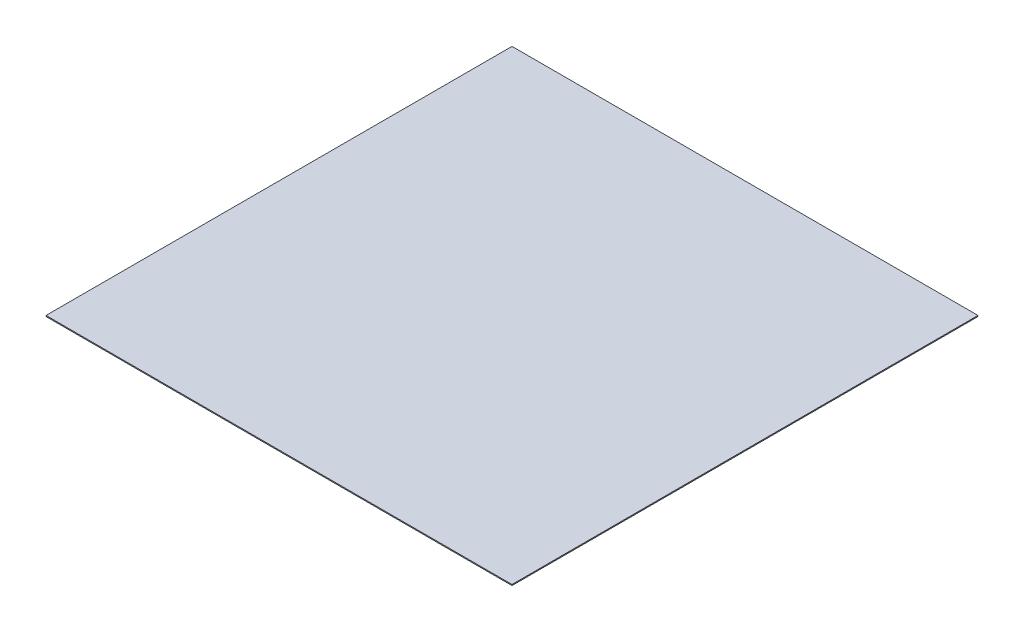
ISO-10303-21;
HEADER;
FILE_DESCRIPTION(('STEP AP214'),'2;1');
FILE_NAME('part.step','',(''),(''),'','','');
FILE_SCHEMA(('AUTOMOTIVE_DESIGN { 1 0 10303 214 1 1 1 1 }'));
ENDSEC;
DATA;
#1=APPLICATION_CONTEXT('core data for automotive mechanical design processes');
#2=APPLICATION_PROTOCOL_DEFINITION('international standard','automotive_design',2000,#1);
#3=PRODUCT_CONTEXT('',#1,'mechanical');
#4=PRODUCT('Part','Part','',(#3));
#5=PRODUCT_RELATED_PRODUCT_CATEGORY('part','',(#4));
#6=PRODUCT_DEFINITION_FORMATION('','',#4);
#7=PRODUCT_DEFINITION_CONTEXT('part definition',#1,'design');
#8=PRODUCT_DEFINITION('design','',#6,#7);
#9=PRODUCT_DEFINITION_SHAPE('','',#8);
#10=(LENGTH_UNIT() NAMED_UNIT(*) SI_UNIT(.MILLI.,.METRE.));
#11=(NAMED_UNIT(*) PLANE_ANGLE_UNIT() SI_UNIT($,.RADIAN.));
#12=(NAMED_UNIT(*) SI_UNIT($,.STERADIAN.) SOLID_ANGLE_UNIT());
#13=UNCERTAINTY_MEASURE_WITH_UNIT(LENGTH_MEASURE(1.E-05),#10,'distance_accuracy_value','');
#14=(GEOMETRIC_REPRESENTATION_CONTEXT(3) GLOBAL_UNCERTAINTY_ASSIGNED_CONTEXT((#13)) GLOBAL_UNIT_ASSIGNED_CONTEXT((#10,
#11,#12)) REPRESENTATION_CONTEXT('',''));
#15=CARTESIAN_POINT('',(0.,0.,0.));
#16=DIRECTION('',(0.,0.,1.));
#17=DIRECTION('',(1.,0.,0.));
#18=AXIS2_PLACEMENT_3D('',#15,#16,#17);
#19=CARTESIAN_POINT('',(69.85,0.15,69.85));
#20=DIRECTION('',(-1.,0.,0.));
#21=DIRECTION('',(0.,0.,1.));
#22=AXIS2_PLACEMENT_3D('',#19,#20,#21);
#23=PLANE('',#22);
#24=DIRECTION('',(0.,0.,-1.));
#25=VECTOR('',#24,1.);
#26=CARTESIAN_POINT('',(69.85,-0.15,69.85));
#27=LINE('',#26,#25);
#28=CARTESIAN_POINT('',(69.85,-0.15,69.85));
#29=VERTEX_POINT('',#28);
#30=CARTESIAN_POINT('',(69.85,-0.15,-69.85));
#31=VERTEX_POINT('',#30);
#32=EDGE_CURVE('E97',#29,#31,#27,.T.);
#33=ORIENTED_EDGE('',*,*,#32,.T.);
#34=DIRECTION('',(0.,-1.,0.));
#35=VECTOR('',#34,1.);
#36=CARTESIAN_POINT('',(69.85,0.15,-69.85));
#37=LINE('',#36,#35);
#38=CARTESIAN_POINT('',(69.85,0.15,-69.85));
#39=VERTEX_POINT('',#38);
#40=EDGE_CURVE('E11',#39,#31,#37,.T.);
#41=ORIENTED_EDGE('',*,*,#40,.F.);
#42=DIRECTION('',(0.,0.,-1.));
#43=VECTOR('',#42,1.);
#44=CARTESIAN_POINT('',(69.85,0.15,69.85));
#45=LINE('',#44,#43);
#46=CARTESIAN_POINT('',(69.85,0.15,69.85));
#47=VERTEX_POINT('',#46);
#48=EDGE_CURVE('E85',#47,#39,#45,.T.);
#49=ORIENTED_EDGE('',*,*,#48,.F.);
#50=DIRECTION('',(0.,-1.,0.));
#51=VECTOR('',#50,1.);
#52=CARTESIAN_POINT('',(69.85,0.15,69.85));
#53=LINE('',#52,#51);
#54=EDGE_CURVE('E93',#47,#29,#53,.T.);
#55=ORIENTED_EDGE('',*,*,#54,.T.);
#56=EDGE_LOOP('',(#33,#41,#49,#55));
#57=FACE_BOUND('',#56,.T.);
#58=ADVANCED_FACE('F34',(#57),#23,.F.);
#59=CARTESIAN_POINT('',(-69.85,0.15,-69.85));
#60=DIRECTION('',(0.,0.,1.));
#61=DIRECTION('',(1.,0.,0.));
#62=AXIS2_PLACEMENT_3D('',#59,#60,#61);
#63=PLANE('',#62);
#64=DIRECTION('',(-1.,0.,0.));
#65=VECTOR('',#64,1.);
#66=CARTESIAN_POINT('',(-69.85,-0.15,-69.85));
#67=LINE('',#66,#65);
#68=CARTESIAN_POINT('',(-69.85,-0.15,-69.85));
#69=VERTEX_POINT('',#68);
#70=EDGE_CURVE('E89',#31,#69,#67,.T.);
#71=ORIENTED_EDGE('',*,*,#70,.T.);
#72=DIRECTION('',(0.,-1.,0.));
#73=VECTOR('',#72,1.);
#74=CARTESIAN_POINT('',(-69.85,0.15,-69.85));
#75=LINE('',#74,#73);
#76=CARTESIAN_POINT('',(-69.85,0.15,-69.85));
#77=VERTEX_POINT('',#76);
#78=EDGE_CURVE('E42',#77,#69,#75,.T.);
#79=ORIENTED_EDGE('',*,*,#78,.F.);
#80=DIRECTION('',(-1.,0.,0.));
#81=VECTOR('',#80,1.);
#82=CARTESIAN_POINT('',(-69.85,0.15,-69.85));
#83=LINE('',#82,#81);
#84=EDGE_CURVE('E80',#39,#77,#83,.T.);
#85=ORIENTED_EDGE('',*,*,#84,.F.);
#86=ORIENTED_EDGE('',*,*,#40,.T.);
#87=EDGE_LOOP('',(#71,#79,#85,#86));
#88=FACE_BOUND('',#87,.T.);
#89=ADVANCED_FACE('F88',(#88),#63,.F.);
#90=CARTESIAN_POINT('',(-69.85,0.15,69.85));
#91=DIRECTION('',(1.,0.,0.));
#92=DIRECTION('',(0.,0.,-1.));
#93=AXIS2_PLACEMENT_3D('',#90,#91,#92);
#94=PLANE('',#93);
#95=DIRECTION('',(0.,0.,1.));
#96=VECTOR('',#95,1.);
#97=CARTESIAN_POINT('',(-69.85,-0.15,69.85));
#98=LINE('',#97,#96);
#99=CARTESIAN_POINT('',(-69.85,-0.15,69.85));
#100=VERTEX_POINT('',#99);
#101=EDGE_CURVE('E67',#69,#100,#98,.T.);
#102=ORIENTED_EDGE('',*,*,#101,.T.);
#103=DIRECTION('',(0.,-1.,0.));
#104=VECTOR('',#103,1.);
#105=CARTESIAN_POINT('',(-69.85,0.15,69.85));
#106=LINE('',#105,#104);
#107=CARTESIAN_POINT('',(-69.85,0.15,69.85));
#108=VERTEX_POINT('',#107);
#109=EDGE_CURVE('E90',#108,#100,#106,.T.);
#110=ORIENTED_EDGE('',*,*,#109,.F.);
#111=DIRECTION('',(0.,0.,1.));
#112=VECTOR('',#111,1.);
#113=CARTESIAN_POINT('',(-69.85,0.15,69.85));
#114=LINE('',#113,#112);
#115=EDGE_CURVE('E83',#77,#108,#114,.T.);
#116=ORIENTED_EDGE('',*,*,#115,.F.);
#117=ORIENTED_EDGE('',*,*,#78,.T.);
#118=EDGE_LOOP('',(#102,#110,#116,#117));
#119=FACE_BOUND('',#118,.T.);
#120=ADVANCED_FACE('F91',(#119),#94,.F.);
#121=CARTESIAN_POINT('',(-69.85,0.15,69.85));
#122=DIRECTION('',(0.,0.,-1.));
#123=DIRECTION('',(-1.,0.,0.));
#124=AXIS2_PLACEMENT_3D('',#121,#122,#123);
#125=PLANE('',#124);
#126=DIRECTION('',(1.,0.,0.));
#127=VECTOR('',#126,1.);
#128=CARTESIAN_POINT('',(-69.85,-0.15,69.85));
#129=LINE('',#128,#127);
#130=EDGE_CURVE('E73',#100,#29,#129,.T.);
#131=ORIENTED_EDGE('',*,*,#130,.T.);
#132=ORIENTED_EDGE('',*,*,#54,.F.);
#133=DIRECTION('',(1.,0.,0.));
#134=VECTOR('',#133,1.);
#135=CARTESIAN_POINT('',(-69.85,0.15,69.85));
#136=LINE('',#135,#134);
#137=EDGE_CURVE('E50',#108,#47,#136,.T.);
#138=ORIENTED_EDGE('',*,*,#137,.F.);
#139=ORIENTED_EDGE('',*,*,#109,.T.);
#140=EDGE_LOOP('',(#131,#132,#138,#139));
#141=FACE_BOUND('',#140,.T.);
#142=ADVANCED_FACE('F104',(#141),#125,.F.);
#143=CARTESIAN_POINT('',(0.,0.15,0.));
#144=DIRECTION('',(0.,-1.,0.));
#145=DIRECTION('',(0.,0.,-1.));
#146=AXIS2_PLACEMENT_3D('',#143,#144,#145);
#147=PLANE('',#146);
#148=ORIENTED_EDGE('',*,*,#48,.T.);
#149=ORIENTED_EDGE('',*,*,#84,.T.);
#150=ORIENTED_EDGE('',*,*,#115,.T.);
#151=ORIENTED_EDGE('',*,*,#137,.T.);
#152=EDGE_LOOP('',(#148,#149,#150,#151));
#153=FACE_BOUND('',#152,.T.);
#154=ADVANCED_FACE('F81',(#153),#147,.F.);
#155=CARTESIAN_POINT('',(0.,-0.15,0.));
#156=DIRECTION('',(0.,-1.,0.));
#157=DIRECTION('',(0.,0.,-1.));
#158=AXIS2_PLACEMENT_3D('',#155,#156,#157);
#159=PLANE('',#158);
#160=ORIENTED_EDGE('',*,*,#32,.F.);
#161=ORIENTED_EDGE('',*,*,#130,.F.);
#162=ORIENTED_EDGE('',*,*,#101,.F.);
#163=ORIENTED_EDGE('',*,*,#70,.F.);
#164=EDGE_LOOP('',(#160,#161,#162,#163));
#165=FACE_BOUND('',#164,.T.);
#166=ADVANCED_FACE('F107',(#165),#159,.T.);
#167=CLOSED_SHELL('',(#58,#89,#120,#142,#154,#166));
#168=MANIFOLD_SOLID_BREP('B2',#167);
#169=ADVANCED_BREP_SHAPE_REPRESENTATION('',(#18,#168),#14);
#170=SHAPE_DEFINITION_REPRESENTATION(#9,#169);
ENDSEC;
END-ISO-10303-21;
